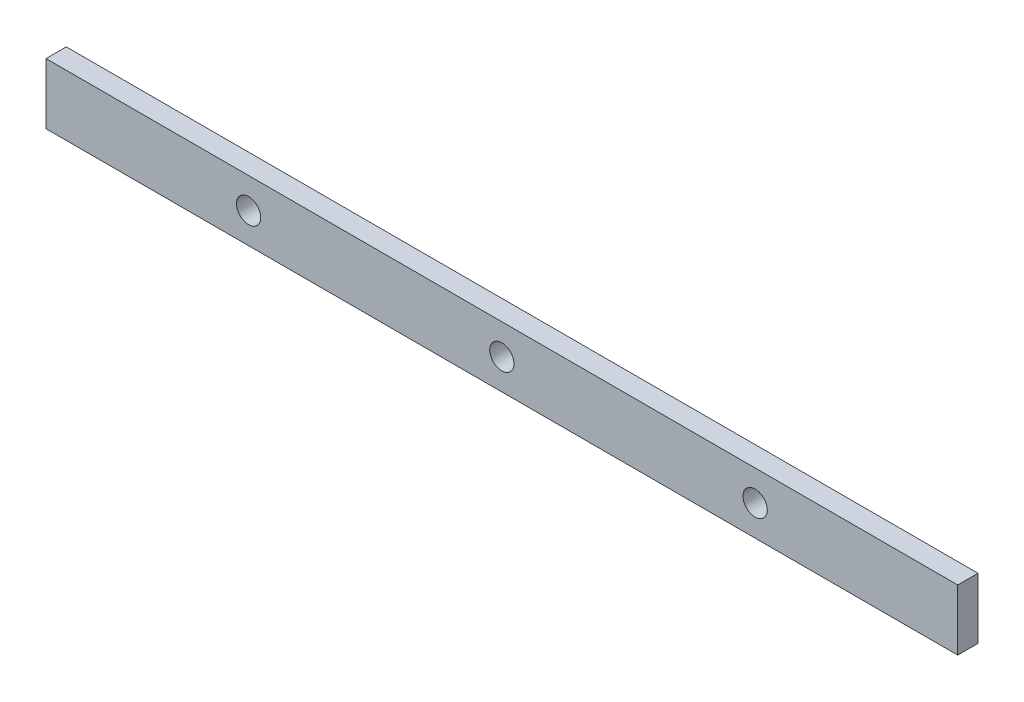
ISO-10303-21;
HEADER;
FILE_DESCRIPTION(('STEP AP214'),'2;1');
FILE_NAME('part.step','',(''),(''),'','','');
FILE_SCHEMA(('AUTOMOTIVE_DESIGN { 1 0 10303 214 1 1 1 1 }'));
ENDSEC;
DATA;
#1=APPLICATION_CONTEXT('core data for automotive mechanical design processes');
#2=APPLICATION_PROTOCOL_DEFINITION('international standard','automotive_design',2000,#1);
#3=PRODUCT_CONTEXT('',#1,'mechanical');
#4=PRODUCT('Part','Part','',(#3));
#5=PRODUCT_RELATED_PRODUCT_CATEGORY('part','',(#4));
#6=PRODUCT_DEFINITION_FORMATION('','',#4);
#7=PRODUCT_DEFINITION_CONTEXT('part definition',#1,'design');
#8=PRODUCT_DEFINITION('design','',#6,#7);
#9=PRODUCT_DEFINITION_SHAPE('','',#8);
#10=(LENGTH_UNIT() NAMED_UNIT(*) SI_UNIT(.MILLI.,.METRE.));
#11=(NAMED_UNIT(*) PLANE_ANGLE_UNIT() SI_UNIT($,.RADIAN.));
#12=(NAMED_UNIT(*) SI_UNIT($,.STERADIAN.) SOLID_ANGLE_UNIT());
#13=UNCERTAINTY_MEASURE_WITH_UNIT(LENGTH_MEASURE(1.E-05),#10,'distance_accuracy_value','');
#14=(GEOMETRIC_REPRESENTATION_CONTEXT(3) GLOBAL_UNCERTAINTY_ASSIGNED_CONTEXT((#13)) GLOBAL_UNIT_ASSIGNED_CONTEXT((#10,
#11,#12)) REPRESENTATION_CONTEXT('',''));
#15=CARTESIAN_POINT('',(0.,0.,0.));
#16=DIRECTION('',(0.,0.,1.));
#17=DIRECTION('',(1.,0.,0.));
#18=AXIS2_PLACEMENT_3D('',#15,#16,#17);
#19=CARTESIAN_POINT('',(0.,0.,10.));
#20=DIRECTION('',(1.,0.,0.));
#21=DIRECTION('',(0.,0.,-1.));
#22=AXIS2_PLACEMENT_3D('',#19,#20,#21);
#23=PLANE('',#22);
#24=DIRECTION('',(0.,-1.,0.));
#25=VECTOR('',#24,1.);
#26=CARTESIAN_POINT('',(0.,0.,0.));
#27=LINE('',#26,#25);
#28=CARTESIAN_POINT('',(0.,30.,0.));
#29=VERTEX_POINT('',#28);
#30=CARTESIAN_POINT('',(0.,0.,0.));
#31=VERTEX_POINT('',#30);
#32=EDGE_CURVE('E96',#29,#31,#27,.T.);
#33=ORIENTED_EDGE('',*,*,#32,.T.);
#34=DIRECTION('',(0.,0.,-1.));
#35=VECTOR('',#34,1.);
#36=CARTESIAN_POINT('',(0.,0.,10.));
#37=LINE('',#36,#35);
#38=CARTESIAN_POINT('',(0.,0.,10.));
#39=VERTEX_POINT('',#38);
#40=EDGE_CURVE('E11',#39,#31,#37,.T.);
#41=ORIENTED_EDGE('',*,*,#40,.F.);
#42=DIRECTION('',(0.,-1.,0.));
#43=VECTOR('',#42,1.);
#44=CARTESIAN_POINT('',(0.,0.,10.));
#45=LINE('',#44,#43);
#46=CARTESIAN_POINT('',(0.,30.,10.));
#47=VERTEX_POINT('',#46);
#48=EDGE_CURVE('E84',#47,#39,#45,.T.);
#49=ORIENTED_EDGE('',*,*,#48,.F.);
#50=DIRECTION('',(0.,0.,-1.));
#51=VECTOR('',#50,1.);
#52=CARTESIAN_POINT('',(0.,30.,10.));
#53=LINE('',#52,#51);
#54=EDGE_CURVE('E92',#47,#29,#53,.T.);
#55=ORIENTED_EDGE('',*,*,#54,.T.);
#56=EDGE_LOOP('',(#33,#41,#49,#55));
#57=FACE_BOUND('',#56,.T.);
#58=ADVANCED_FACE('F33',(#57),#23,.F.);
#59=CARTESIAN_POINT('',(0.,0.,10.));
#60=DIRECTION('',(0.,1.,0.));
#61=DIRECTION('',(0.,0.,1.));
#62=AXIS2_PLACEMENT_3D('',#59,#60,#61);
#63=PLANE('',#62);
#64=DIRECTION('',(1.,0.,0.));
#65=VECTOR('',#64,1.);
#66=CARTESIAN_POINT('',(0.,0.,0.));
#67=LINE('',#66,#65);
#68=CARTESIAN_POINT('',(450.,0.,0.));
#69=VERTEX_POINT('',#68);
#70=EDGE_CURVE('E88',#31,#69,#67,.T.);
#71=ORIENTED_EDGE('',*,*,#70,.T.);
#72=DIRECTION('',(0.,0.,-1.));
#73=VECTOR('',#72,1.);
#74=CARTESIAN_POINT('',(450.,0.,10.));
#75=LINE('',#74,#73);
#76=CARTESIAN_POINT('',(450.,0.,10.));
#77=VERTEX_POINT('',#76);
#78=EDGE_CURVE('E41',#77,#69,#75,.T.);
#79=ORIENTED_EDGE('',*,*,#78,.F.);
#80=DIRECTION('',(1.,0.,0.));
#81=VECTOR('',#80,1.);
#82=CARTESIAN_POINT('',(0.,0.,10.));
#83=LINE('',#82,#81);
#84=EDGE_CURVE('E79',#39,#77,#83,.T.);
#85=ORIENTED_EDGE('',*,*,#84,.F.);
#86=ORIENTED_EDGE('',*,*,#40,.T.);
#87=EDGE_LOOP('',(#71,#79,#85,#86));
#88=FACE_BOUND('',#87,.T.);
#89=ADVANCED_FACE('F87',(#88),#63,.F.);
#90=CARTESIAN_POINT('',(450.,0.,10.));
#91=DIRECTION('',(-1.,0.,0.));
#92=DIRECTION('',(0.,0.,1.));
#93=AXIS2_PLACEMENT_3D('',#90,#91,#92);
#94=PLANE('',#93);
#95=DIRECTION('',(0.,1.,0.));
#96=VECTOR('',#95,1.);
#97=CARTESIAN_POINT('',(450.,0.,0.));
#98=LINE('',#97,#96);
#99=CARTESIAN_POINT('',(450.,30.,0.));
#100=VERTEX_POINT('',#99);
#101=EDGE_CURVE('E66',#69,#100,#98,.T.);
#102=ORIENTED_EDGE('',*,*,#101,.T.);
#103=DIRECTION('',(0.,0.,-1.));
#104=VECTOR('',#103,1.);
#105=CARTESIAN_POINT('',(450.,30.,10.));
#106=LINE('',#105,#104);
#107=CARTESIAN_POINT('',(450.,30.,10.));
#108=VERTEX_POINT('',#107);
#109=EDGE_CURVE('E89',#108,#100,#106,.T.);
#110=ORIENTED_EDGE('',*,*,#109,.F.);
#111=DIRECTION('',(0.,1.,0.));
#112=VECTOR('',#111,1.);
#113=CARTESIAN_POINT('',(450.,0.,10.));
#114=LINE('',#113,#112);
#115=EDGE_CURVE('E82',#77,#108,#114,.T.);
#116=ORIENTED_EDGE('',*,*,#115,.F.);
#117=ORIENTED_EDGE('',*,*,#78,.T.);
#118=EDGE_LOOP('',(#102,#110,#116,#117));
#119=FACE_BOUND('',#118,.T.);
#120=ADVANCED_FACE('F90',(#119),#94,.F.);
#121=CARTESIAN_POINT('',(0.,30.,10.));
#122=DIRECTION('',(0.,-1.,0.));
#123=DIRECTION('',(1.,0.,0.));
#124=AXIS2_PLACEMENT_3D('',#121,#122,#123);
#125=PLANE('',#124);
#126=DIRECTION('',(-1.,0.,0.));
#127=VECTOR('',#126,1.);
#128=CARTESIAN_POINT('',(0.,30.,0.));
#129=LINE('',#128,#127);
#130=EDGE_CURVE('E72',#100,#29,#129,.T.);
#131=ORIENTED_EDGE('',*,*,#130,.T.);
#132=ORIENTED_EDGE('',*,*,#54,.F.);
#133=DIRECTION('',(-1.,0.,0.));
#134=VECTOR('',#133,1.);
#135=CARTESIAN_POINT('',(0.,30.,10.));
#136=LINE('',#135,#134);
#137=EDGE_CURVE('E49',#108,#47,#136,.T.);
#138=ORIENTED_EDGE('',*,*,#137,.F.);
#139=ORIENTED_EDGE('',*,*,#109,.T.);
#140=EDGE_LOOP('',(#131,#132,#138,#139));
#141=FACE_BOUND('',#140,.T.);
#142=ADVANCED_FACE('F104',(#141),#125,.F.);
#143=CARTESIAN_POINT('',(0.,0.,10.));
#144=DIRECTION('',(0.,0.,-1.));
#145=DIRECTION('',(-1.,0.,0.));
#146=AXIS2_PLACEMENT_3D('',#143,#144,#145);
#147=PLANE('',#146);
#148=CARTESIAN_POINT('',(100.,15.,10.));
#149=DIRECTION('',(0.,0.,1.));
#150=DIRECTION('',(-1.,0.,0.));
#151=AXIS2_PLACEMENT_3D('',#148,#149,#150);
#152=CIRCLE('',#151,5.99999999999999);
#153=CARTESIAN_POINT('',(94.,15.,10.));
#154=VERTEX_POINT('',#153);
#155=EDGE_CURVE('E116',#154,#154,#152,.T.);
#156=ORIENTED_EDGE('',*,*,#155,.F.);
#157=EDGE_LOOP('',(#156));
#158=FACE_BOUND('',#157,.T.);
#159=CARTESIAN_POINT('',(350.,15.,10.));
#160=DIRECTION('',(0.,0.,1.));
#161=DIRECTION('',(1.,0.,0.));
#162=AXIS2_PLACEMENT_3D('',#159,#160,#161);
#163=CIRCLE('',#162,5.99999999999999);
#164=CARTESIAN_POINT('',(356.,15.,10.));
#165=VERTEX_POINT('',#164);
#166=EDGE_CURVE('E122',#165,#165,#163,.T.);
#167=ORIENTED_EDGE('',*,*,#166,.F.);
#168=EDGE_LOOP('',(#167));
#169=FACE_BOUND('',#168,.T.);
#170=CARTESIAN_POINT('',(225.,15.,10.));
#171=DIRECTION('',(0.,0.,1.));
#172=DIRECTION('',(1.,0.,0.));
#173=AXIS2_PLACEMENT_3D('',#170,#171,#172);
#174=CIRCLE('',#173,6.00000000000002);
#175=CARTESIAN_POINT('',(231.,15.,10.));
#176=VERTEX_POINT('',#175);
#177=EDGE_CURVE('E110',#176,#176,#174,.T.);
#178=ORIENTED_EDGE('',*,*,#177,.F.);
#179=EDGE_LOOP('',(#178));
#180=FACE_BOUND('',#179,.T.);
#181=ORIENTED_EDGE('',*,*,#48,.T.);
#182=ORIENTED_EDGE('',*,*,#84,.T.);
#183=ORIENTED_EDGE('',*,*,#115,.T.);
#184=ORIENTED_EDGE('',*,*,#137,.T.);
#185=EDGE_LOOP('',(#181,#182,#183,#184));
#186=FACE_BOUND('',#185,.T.);
#187=ADVANCED_FACE('F80',(#158,#169,#180,#186),#147,.F.);
#188=CARTESIAN_POINT('',(0.,0.,0.));
#189=DIRECTION('',(0.,0.,-1.));
#190=DIRECTION('',(-1.,0.,0.));
#191=AXIS2_PLACEMENT_3D('',#188,#189,#190);
#192=PLANE('',#191);
#193=CARTESIAN_POINT('',(100.,15.,0.));
#194=DIRECTION('',(0.,0.,1.));
#195=DIRECTION('',(-1.,0.,0.));
#196=AXIS2_PLACEMENT_3D('',#193,#194,#195);
#197=CIRCLE('',#196,5.99999999999999);
#198=CARTESIAN_POINT('',(94.,15.,0.));
#199=VERTEX_POINT('',#198);
#200=EDGE_CURVE('E119',#199,#199,#197,.T.);
#201=ORIENTED_EDGE('',*,*,#200,.T.);
#202=EDGE_LOOP('',(#201));
#203=FACE_BOUND('',#202,.T.);
#204=CARTESIAN_POINT('',(350.,15.,0.));
#205=DIRECTION('',(0.,0.,1.));
#206=DIRECTION('',(1.,0.,0.));
#207=AXIS2_PLACEMENT_3D('',#204,#205,#206);
#208=CIRCLE('',#207,5.99999999999999);
#209=CARTESIAN_POINT('',(356.,15.,0.));
#210=VERTEX_POINT('',#209);
#211=EDGE_CURVE('E113',#210,#210,#208,.T.);
#212=ORIENTED_EDGE('',*,*,#211,.T.);
#213=EDGE_LOOP('',(#212));
#214=FACE_BOUND('',#213,.T.);
#215=CARTESIAN_POINT('',(225.,15.,0.));
#216=DIRECTION('',(0.,0.,1.));
#217=DIRECTION('',(1.,0.,0.));
#218=AXIS2_PLACEMENT_3D('',#215,#216,#217);
#219=CIRCLE('',#218,6.00000000000002);
#220=CARTESIAN_POINT('',(231.,15.,0.));
#221=VERTEX_POINT('',#220);
#222=EDGE_CURVE('E99',#221,#221,#219,.T.);
#223=ORIENTED_EDGE('',*,*,#222,.T.);
#224=EDGE_LOOP('',(#223));
#225=FACE_BOUND('',#224,.T.);
#226=ORIENTED_EDGE('',*,*,#32,.F.);
#227=ORIENTED_EDGE('',*,*,#130,.F.);
#228=ORIENTED_EDGE('',*,*,#101,.F.);
#229=ORIENTED_EDGE('',*,*,#70,.F.);
#230=EDGE_LOOP('',(#226,#227,#228,#229));
#231=FACE_BOUND('',#230,.T.);
#232=ADVANCED_FACE('F107',(#203,#214,#225,#231),#192,.T.);
#233=CARTESIAN_POINT('',(225.,15.,0.));
#234=DIRECTION('',(0.,0.,1.));
#235=DIRECTION('',(1.,0.,0.));
#236=AXIS2_PLACEMENT_3D('',#233,#234,#235);
#237=CYLINDRICAL_SURFACE('',#236,6.00000000000002);
#238=ORIENTED_EDGE('',*,*,#222,.F.);
#239=EDGE_LOOP('',(#238));
#240=FACE_BOUND('',#239,.T.);
#241=ORIENTED_EDGE('',*,*,#177,.T.);
#242=EDGE_LOOP('',(#241));
#243=FACE_BOUND('',#242,.T.);
#244=ADVANCED_FACE('F134',(#240,#243),#237,.F.);
#245=CARTESIAN_POINT('',(350.,15.,0.));
#246=DIRECTION('',(0.,0.,1.));
#247=DIRECTION('',(1.,0.,0.));
#248=AXIS2_PLACEMENT_3D('',#245,#246,#247);
#249=CYLINDRICAL_SURFACE('',#248,5.99999999999999);
#250=ORIENTED_EDGE('',*,*,#211,.F.);
#251=EDGE_LOOP('',(#250));
#252=FACE_BOUND('',#251,.T.);
#253=ORIENTED_EDGE('',*,*,#166,.T.);
#254=EDGE_LOOP('',(#253));
#255=FACE_BOUND('',#254,.T.);
#256=ADVANCED_FACE('F130',(#252,#255),#249,.F.);
#257=CARTESIAN_POINT('',(100.,15.,0.));
#258=DIRECTION('',(0.,0.,1.));
#259=DIRECTION('',(1.,0.,0.));
#260=AXIS2_PLACEMENT_3D('',#257,#258,#259);
#261=CYLINDRICAL_SURFACE('',#260,5.99999999999999);
#262=ORIENTED_EDGE('',*,*,#200,.F.);
#263=EDGE_LOOP('',(#262));
#264=FACE_BOUND('',#263,.T.);
#265=ORIENTED_EDGE('',*,*,#155,.T.);
#266=EDGE_LOOP('',(#265));
#267=FACE_BOUND('',#266,.T.);
#268=ADVANCED_FACE('F133',(#264,#267),#261,.F.);
#269=CLOSED_SHELL('',(#58,#89,#120,#142,#187,#232,#244,#256,#268));
#270=MANIFOLD_SOLID_BREP('B2',#269);
#271=ADVANCED_BREP_SHAPE_REPRESENTATION('',(#18,#270),#14);
#272=SHAPE_DEFINITION_REPRESENTATION(#9,#271);
ENDSEC;
END-ISO-10303-21;
